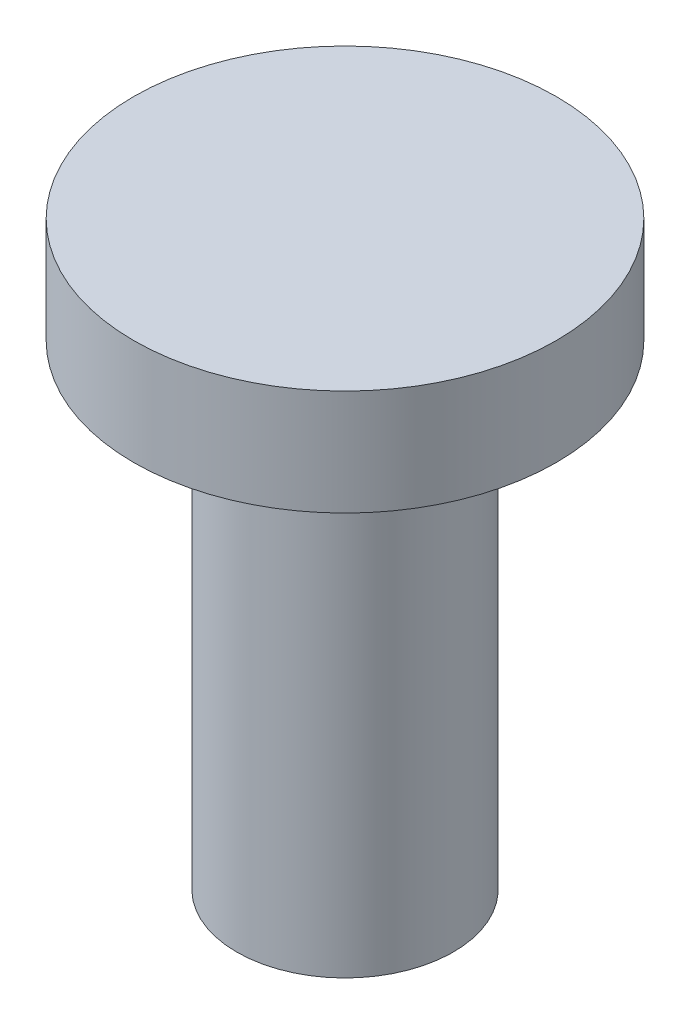
ISO-10303-21;
HEADER;
FILE_DESCRIPTION(('STEP AP214'),'2;1');
FILE_NAME('part.step','',(''),(''),'','','');
FILE_SCHEMA(('AUTOMOTIVE_DESIGN { 1 0 10303 214 1 1 1 1 }'));
ENDSEC;
DATA;
#1=APPLICATION_CONTEXT('core data for automotive mechanical design processes');
#2=APPLICATION_PROTOCOL_DEFINITION('international standard','automotive_design',2000,#1);
#3=PRODUCT_CONTEXT('',#1,'mechanical');
#4=PRODUCT('Part','Part','',(#3));
#5=PRODUCT_RELATED_PRODUCT_CATEGORY('part','',(#4));
#6=PRODUCT_DEFINITION_FORMATION('','',#4);
#7=PRODUCT_DEFINITION_CONTEXT('part definition',#1,'design');
#8=PRODUCT_DEFINITION('design','',#6,#7);
#9=PRODUCT_DEFINITION_SHAPE('','',#8);
#10=(LENGTH_UNIT() NAMED_UNIT(*) SI_UNIT(.MILLI.,.METRE.));
#11=(NAMED_UNIT(*) PLANE_ANGLE_UNIT() SI_UNIT($,.RADIAN.));
#12=(NAMED_UNIT(*) SI_UNIT($,.STERADIAN.) SOLID_ANGLE_UNIT());
#13=UNCERTAINTY_MEASURE_WITH_UNIT(LENGTH_MEASURE(1.E-05),#10,'distance_accuracy_value','');
#14=(GEOMETRIC_REPRESENTATION_CONTEXT(3) GLOBAL_UNCERTAINTY_ASSIGNED_CONTEXT((#13)) GLOBAL_UNIT_ASSIGNED_CONTEXT((#10,
#11,#12)) REPRESENTATION_CONTEXT('',''));
#15=CARTESIAN_POINT('',(0.,0.,0.));
#16=DIRECTION('',(0.,0.,1.));
#17=DIRECTION('',(1.,0.,0.));
#18=AXIS2_PLACEMENT_3D('',#15,#16,#17);
#19=CARTESIAN_POINT('',(0.,4.5,0.));
#20=DIRECTION('',(0.,-1.,0.));
#21=DIRECTION('',(0.,0.,-1.));
#22=AXIS2_PLACEMENT_3D('',#19,#20,#21);
#23=CYLINDRICAL_SURFACE('',#22,1.025);
#24=CARTESIAN_POINT('',(0.,4.5,0.));
#25=DIRECTION('',(0.,1.,0.));
#26=DIRECTION('',(0.,0.,1.));
#27=AXIS2_PLACEMENT_3D('',#24,#25,#26);
#28=CIRCLE('',#27,1.025);
#29=CARTESIAN_POINT('',(0.,4.5,1.025));
#30=VERTEX_POINT('',#29);
#31=EDGE_CURVE('E10',#30,#30,#28,.T.);
#32=ORIENTED_EDGE('',*,*,#31,.F.);
#33=EDGE_LOOP('',(#32));
#34=FACE_BOUND('',#33,.T.);
#35=CARTESIAN_POINT('',(0.,0.,0.));
#36=DIRECTION('',(0.,1.,0.));
#37=DIRECTION('',(0.,0.,1.));
#38=AXIS2_PLACEMENT_3D('',#35,#36,#37);
#39=CIRCLE('',#38,1.025);
#40=CARTESIAN_POINT('',(0.,0.,1.025));
#41=VERTEX_POINT('',#40);
#42=EDGE_CURVE('E34',#41,#41,#39,.T.);
#43=ORIENTED_EDGE('',*,*,#42,.T.);
#44=EDGE_LOOP('',(#43));
#45=FACE_BOUND('',#44,.T.);
#46=ADVANCED_FACE('F31',(#34,#45),#23,.T.);
#47=CARTESIAN_POINT('',(0.,0.,0.));
#48=DIRECTION('',(0.,1.,0.));
#49=DIRECTION('',(0.,0.,1.));
#50=AXIS2_PLACEMENT_3D('',#47,#48,#49);
#51=PLANE('',#50);
#52=ORIENTED_EDGE('',*,*,#42,.F.);
#53=EDGE_LOOP('',(#52));
#54=FACE_BOUND('',#53,.T.);
#55=ADVANCED_FACE('F54',(#54),#51,.F.);
#56=CARTESIAN_POINT('',(0.,5.5,0.));
#57=DIRECTION('',(0.,-1.,0.));
#58=DIRECTION('',(0.,0.,-1.));
#59=AXIS2_PLACEMENT_3D('',#56,#57,#58);
#60=CYLINDRICAL_SURFACE('',#59,2.);
#61=CARTESIAN_POINT('',(0.,5.5,0.));
#62=DIRECTION('',(0.,1.,0.));
#63=DIRECTION('',(0.,0.,1.));
#64=AXIS2_PLACEMENT_3D('',#61,#62,#63);
#65=CIRCLE('',#64,2.);
#66=CARTESIAN_POINT('',(0.,5.5,2.));
#67=VERTEX_POINT('',#66);
#68=EDGE_CURVE('E41',#67,#67,#65,.T.);
#69=ORIENTED_EDGE('',*,*,#68,.F.);
#70=EDGE_LOOP('',(#69));
#71=FACE_BOUND('',#70,.T.);
#72=CARTESIAN_POINT('',(0.,4.5,0.));
#73=DIRECTION('',(0.,1.,0.));
#74=DIRECTION('',(0.,0.,1.));
#75=AXIS2_PLACEMENT_3D('',#72,#73,#74);
#76=CIRCLE('',#75,2.);
#77=CARTESIAN_POINT('',(0.,4.5,2.));
#78=VERTEX_POINT('',#77);
#79=EDGE_CURVE('E43',#78,#78,#76,.T.);
#80=ORIENTED_EDGE('',*,*,#79,.T.);
#81=EDGE_LOOP('',(#80));
#82=FACE_BOUND('',#81,.T.);
#83=ADVANCED_FACE('F51',(#71,#82),#60,.T.);
#84=CARTESIAN_POINT('',(0.,5.5,0.));
#85=DIRECTION('',(0.,1.,0.));
#86=DIRECTION('',(0.,0.,1.));
#87=AXIS2_PLACEMENT_3D('',#84,#85,#86);
#88=PLANE('',#87);
#89=ORIENTED_EDGE('',*,*,#68,.T.);
#90=EDGE_LOOP('',(#89));
#91=FACE_BOUND('',#90,.T.);
#92=ADVANCED_FACE('F49',(#91),#88,.T.);
#93=CARTESIAN_POINT('',(0.,4.5,0.));
#94=DIRECTION('',(0.,1.,0.));
#95=DIRECTION('',(0.,0.,1.));
#96=AXIS2_PLACEMENT_3D('',#93,#94,#95);
#97=PLANE('',#96);
#98=ORIENTED_EDGE('',*,*,#31,.T.);
#99=EDGE_LOOP('',(#98));
#100=FACE_BOUND('',#99,.T.);
#101=ORIENTED_EDGE('',*,*,#79,.F.);
#102=EDGE_LOOP('',(#101));
#103=FACE_BOUND('',#102,.T.);
#104=ADVANCED_FACE('F58',(#100,#103),#97,.F.);
#105=CLOSED_SHELL('',(#46,#55,#83,#92,#104));
#106=MANIFOLD_SOLID_BREP('B2',#105);
#107=ADVANCED_BREP_SHAPE_REPRESENTATION('',(#18,#106),#14);
#108=SHAPE_DEFINITION_REPRESENTATION(#9,#107);
ENDSEC;
END-ISO-10303-21;
